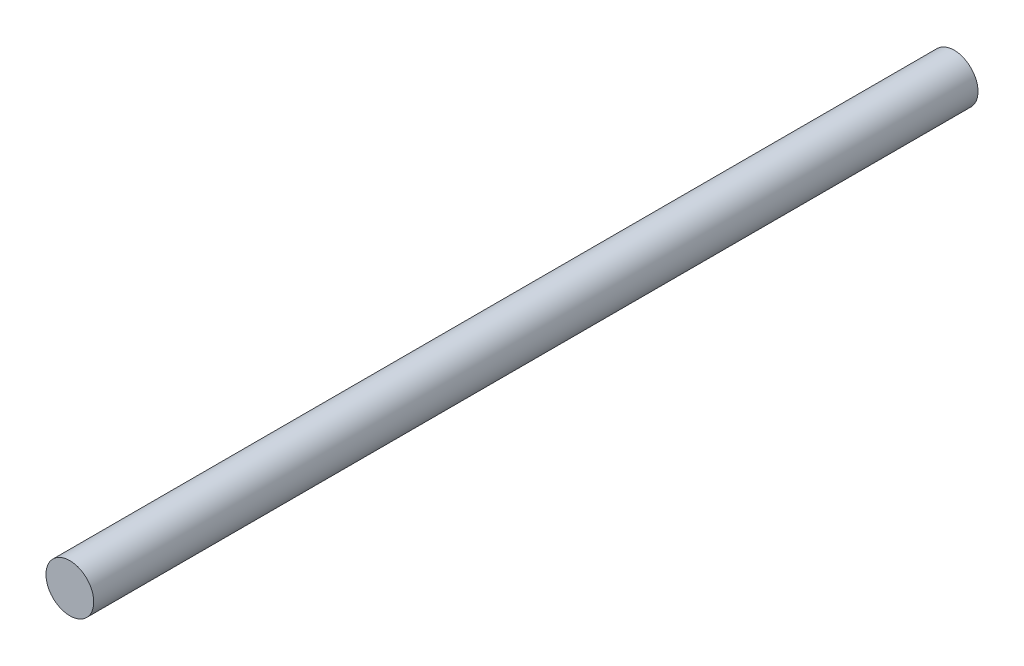
ISO-10303-21;
HEADER;
FILE_DESCRIPTION(('STEP AP214'),'2;1');
FILE_NAME('part.step','',(''),(''),'','','');
FILE_SCHEMA(('AUTOMOTIVE_DESIGN { 1 0 10303 214 1 1 1 1 }'));
ENDSEC;
DATA;
#1=APPLICATION_CONTEXT('core data for automotive mechanical design processes');
#2=APPLICATION_PROTOCOL_DEFINITION('international standard','automotive_design',2000,#1);
#3=PRODUCT_CONTEXT('',#1,'mechanical');
#4=PRODUCT('Part','Part','',(#3));
#5=PRODUCT_RELATED_PRODUCT_CATEGORY('part','',(#4));
#6=PRODUCT_DEFINITION_FORMATION('','',#4);
#7=PRODUCT_DEFINITION_CONTEXT('part definition',#1,'design');
#8=PRODUCT_DEFINITION('design','',#6,#7);
#9=PRODUCT_DEFINITION_SHAPE('','',#8);
#10=(LENGTH_UNIT() NAMED_UNIT(*) SI_UNIT(.MILLI.,.METRE.));
#11=(NAMED_UNIT(*) PLANE_ANGLE_UNIT() SI_UNIT($,.RADIAN.));
#12=(NAMED_UNIT(*) SI_UNIT($,.STERADIAN.) SOLID_ANGLE_UNIT());
#13=UNCERTAINTY_MEASURE_WITH_UNIT(LENGTH_MEASURE(1.E-05),#10,'distance_accuracy_value','');
#14=(GEOMETRIC_REPRESENTATION_CONTEXT(3) GLOBAL_UNCERTAINTY_ASSIGNED_CONTEXT((#13)) GLOBAL_UNIT_ASSIGNED_CONTEXT((#10,
#11,#12)) REPRESENTATION_CONTEXT('',''));
#15=CARTESIAN_POINT('',(0.,0.,0.));
#16=DIRECTION('',(0.,0.,1.));
#17=DIRECTION('',(1.,0.,0.));
#18=AXIS2_PLACEMENT_3D('',#15,#16,#17);
#19=CARTESIAN_POINT('',(0.,0.,-370.));
#20=DIRECTION('',(0.,0.,1.));
#21=DIRECTION('',(1.,0.,0.));
#22=AXIS2_PLACEMENT_3D('',#19,#20,#21);
#23=CYLINDRICAL_SURFACE('',#22,10.);
#24=CARTESIAN_POINT('',(0.,0.,-370.));
#25=DIRECTION('',(0.,0.,1.));
#26=DIRECTION('',(1.,0.,0.));
#27=AXIS2_PLACEMENT_3D('',#24,#25,#26);
#28=CIRCLE('',#27,10.);
#29=CARTESIAN_POINT('',(10.,0.,-370.));
#30=VERTEX_POINT('',#29);
#31=EDGE_CURVE('E10',#30,#30,#28,.T.);
#32=ORIENTED_EDGE('',*,*,#31,.T.);
#33=EDGE_LOOP('',(#32));
#34=FACE_BOUND('',#33,.T.);
#35=CARTESIAN_POINT('',(0.,0.,0.));
#36=DIRECTION('',(0.,0.,1.));
#37=DIRECTION('',(1.,0.,0.));
#38=AXIS2_PLACEMENT_3D('',#35,#36,#37);
#39=CIRCLE('',#38,10.);
#40=CARTESIAN_POINT('',(10.,0.,0.));
#41=VERTEX_POINT('',#40);
#42=EDGE_CURVE('E43',#41,#41,#39,.T.);
#43=ORIENTED_EDGE('',*,*,#42,.F.);
#44=EDGE_LOOP('',(#43));
#45=FACE_BOUND('',#44,.T.);
#46=ADVANCED_FACE('F40',(#34,#45),#23,.T.);
#47=CARTESIAN_POINT('',(0.,0.,-370.));
#48=DIRECTION('',(0.,0.,1.));
#49=DIRECTION('',(1.,0.,0.));
#50=AXIS2_PLACEMENT_3D('',#47,#48,#49);
#51=PLANE('',#50);
#52=ORIENTED_EDGE('',*,*,#31,.F.);
#53=EDGE_LOOP('',(#52));
#54=FACE_BOUND('',#53,.T.);
#55=ADVANCED_FACE('F55',(#54),#51,.F.);
#56=CARTESIAN_POINT('',(0.,0.,0.));
#57=DIRECTION('',(0.,0.,1.));
#58=DIRECTION('',(1.,0.,0.));
#59=AXIS2_PLACEMENT_3D('',#56,#57,#58);
#60=PLANE('',#59);
#61=ORIENTED_EDGE('',*,*,#42,.T.);
#62=EDGE_LOOP('',(#61));
#63=FACE_BOUND('',#62,.T.);
#64=ADVANCED_FACE('F52',(#63),#60,.T.);
#65=CLOSED_SHELL('',(#46,#55,#64));
#66=MANIFOLD_SOLID_BREP('B2',#65);
#67=ADVANCED_BREP_SHAPE_REPRESENTATION('',(#18,#66),#14);
#68=SHAPE_DEFINITION_REPRESENTATION(#9,#67);
ENDSEC;
END-ISO-10303-21;
